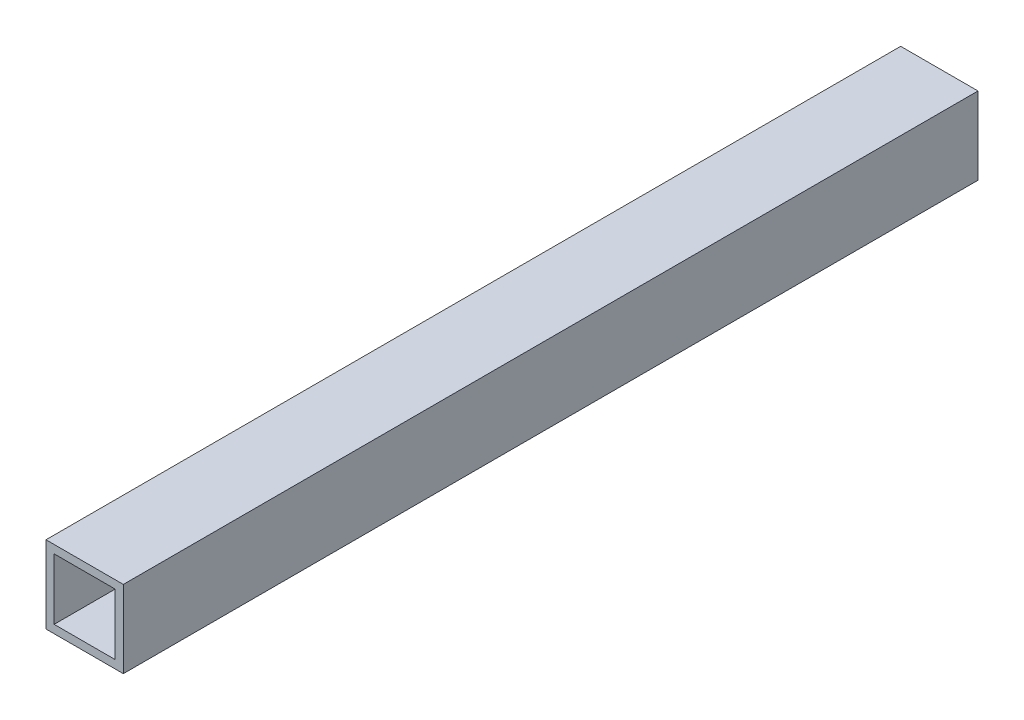
ISO-10303-21;
HEADER;
FILE_DESCRIPTION(('STEP AP214'),'2;1');
FILE_NAME('part.step','',(''),(''),'','','');
FILE_SCHEMA(('AUTOMOTIVE_DESIGN { 1 0 10303 214 1 1 1 1 }'));
ENDSEC;
DATA;
#1=APPLICATION_CONTEXT('core data for automotive mechanical design processes');
#2=APPLICATION_PROTOCOL_DEFINITION('international standard','automotive_design',2000,#1);
#3=PRODUCT_CONTEXT('',#1,'mechanical');
#4=PRODUCT('Part','Part','',(#3));
#5=PRODUCT_RELATED_PRODUCT_CATEGORY('part','',(#4));
#6=PRODUCT_DEFINITION_FORMATION('','',#4);
#7=PRODUCT_DEFINITION_CONTEXT('part definition',#1,'design');
#8=PRODUCT_DEFINITION('design','',#6,#7);
#9=PRODUCT_DEFINITION_SHAPE('','',#8);
#10=(LENGTH_UNIT() NAMED_UNIT(*) SI_UNIT(.MILLI.,.METRE.));
#11=(NAMED_UNIT(*) PLANE_ANGLE_UNIT() SI_UNIT($,.RADIAN.));
#12=(NAMED_UNIT(*) SI_UNIT($,.STERADIAN.) SOLID_ANGLE_UNIT());
#13=UNCERTAINTY_MEASURE_WITH_UNIT(LENGTH_MEASURE(1.E-05),#10,'distance_accuracy_value','');
#14=(GEOMETRIC_REPRESENTATION_CONTEXT(3) GLOBAL_UNCERTAINTY_ASSIGNED_CONTEXT((#13)) GLOBAL_UNIT_ASSIGNED_CONTEXT((#10,
#11,#12)) REPRESENTATION_CONTEXT('',''));
#15=CARTESIAN_POINT('',(0.,0.,0.));
#16=DIRECTION('',(0.,0.,1.));
#17=DIRECTION('',(1.,0.,0.));
#18=AXIS2_PLACEMENT_3D('',#15,#16,#17);
#19=CARTESIAN_POINT('',(0.,0.,210.));
#20=DIRECTION('',(0.,0.,-1.));
#21=DIRECTION('',(-1.,0.,0.));
#22=AXIS2_PLACEMENT_3D('',#19,#20,#21);
#23=PLANE('',#22);
#24=DIRECTION('',(0.,1.,0.));
#25=VECTOR('',#24,1.);
#26=CARTESIAN_POINT('',(9.5,-9.5,210.));
#27=LINE('',#26,#25);
#28=CARTESIAN_POINT('',(9.5,-9.5,210.));
#29=VERTEX_POINT('',#28);
#30=CARTESIAN_POINT('',(9.5,9.5,210.));
#31=VERTEX_POINT('',#30);
#32=EDGE_CURVE('E138',#29,#31,#27,.T.);
#33=ORIENTED_EDGE('',*,*,#32,.T.);
#34=DIRECTION('',(-1.,0.,0.));
#35=VECTOR('',#34,1.);
#36=CARTESIAN_POINT('',(-9.5,9.5,210.));
#37=LINE('',#36,#35);
#38=CARTESIAN_POINT('',(-9.5,9.5,210.));
#39=VERTEX_POINT('',#38);
#40=EDGE_CURVE('E141',#31,#39,#37,.T.);
#41=ORIENTED_EDGE('',*,*,#40,.T.);
#42=DIRECTION('',(0.,-1.,0.));
#43=VECTOR('',#42,1.);
#44=CARTESIAN_POINT('',(-9.5,-9.5,210.));
#45=LINE('',#44,#43);
#46=CARTESIAN_POINT('',(-9.5,-9.5,210.));
#47=VERTEX_POINT('',#46);
#48=EDGE_CURVE('E144',#39,#47,#45,.T.);
#49=ORIENTED_EDGE('',*,*,#48,.T.);
#50=DIRECTION('',(1.,0.,0.));
#51=VECTOR('',#50,1.);
#52=CARTESIAN_POINT('',(-9.5,-9.5,210.));
#53=LINE('',#52,#51);
#54=EDGE_CURVE('E146',#47,#29,#53,.T.);
#55=ORIENTED_EDGE('',*,*,#54,.T.);
#56=EDGE_LOOP('',(#33,#41,#49,#55));
#57=FACE_BOUND('',#56,.T.);
#58=DIRECTION('',(0.,-1.,0.));
#59=VECTOR('',#58,1.);
#60=CARTESIAN_POINT('',(-7.5,-7.5,210.));
#61=LINE('',#60,#59);
#62=CARTESIAN_POINT('',(-7.5,7.5,210.));
#63=VERTEX_POINT('',#62);
#64=CARTESIAN_POINT('',(-7.5,-7.5,210.));
#65=VERTEX_POINT('',#64);
#66=EDGE_CURVE('E102',#63,#65,#61,.T.);
#67=ORIENTED_EDGE('',*,*,#66,.F.);
#68=DIRECTION('',(-1.,0.,0.));
#69=VECTOR('',#68,1.);
#70=CARTESIAN_POINT('',(-7.5,7.5,210.));
#71=LINE('',#70,#69);
#72=CARTESIAN_POINT('',(7.5,7.5,210.));
#73=VERTEX_POINT('',#72);
#74=EDGE_CURVE('E124',#73,#63,#71,.T.);
#75=ORIENTED_EDGE('',*,*,#74,.F.);
#76=DIRECTION('',(0.,1.,0.));
#77=VECTOR('',#76,1.);
#78=CARTESIAN_POINT('',(7.5,-7.5,210.));
#79=LINE('',#78,#77);
#80=CARTESIAN_POINT('',(7.5,-7.5,210.));
#81=VERTEX_POINT('',#80);
#82=EDGE_CURVE('E122',#81,#73,#79,.T.);
#83=ORIENTED_EDGE('',*,*,#82,.F.);
#84=DIRECTION('',(1.,0.,0.));
#85=VECTOR('',#84,1.);
#86=CARTESIAN_POINT('',(-7.5,-7.5,210.));
#87=LINE('',#86,#85);
#88=EDGE_CURVE('E110',#65,#81,#87,.T.);
#89=ORIENTED_EDGE('',*,*,#88,.F.);
#90=EDGE_LOOP('',(#67,#75,#83,#89));
#91=FACE_BOUND('',#90,.T.);
#92=ADVANCED_FACE('F37',(#57,#91),#23,.F.);
#93=CARTESIAN_POINT('',(0.,0.,0.));
#94=DIRECTION('',(0.,0.,-1.));
#95=DIRECTION('',(-1.,0.,0.));
#96=AXIS2_PLACEMENT_3D('',#93,#94,#95);
#97=PLANE('',#96);
#98=DIRECTION('',(0.,1.,0.));
#99=VECTOR('',#98,1.);
#100=CARTESIAN_POINT('',(9.5,-9.5,0.));
#101=LINE('',#100,#99);
#102=CARTESIAN_POINT('',(9.5,-9.5,0.));
#103=VERTEX_POINT('',#102);
#104=CARTESIAN_POINT('',(9.5,9.5,0.));
#105=VERTEX_POINT('',#104);
#106=EDGE_CURVE('E118',#103,#105,#101,.T.);
#107=ORIENTED_EDGE('',*,*,#106,.F.);
#108=DIRECTION('',(1.,0.,0.));
#109=VECTOR('',#108,1.);
#110=CARTESIAN_POINT('',(-9.5,-9.5,0.));
#111=LINE('',#110,#109);
#112=CARTESIAN_POINT('',(-9.5,-9.5,0.));
#113=VERTEX_POINT('',#112);
#114=EDGE_CURVE('E142',#113,#103,#111,.T.);
#115=ORIENTED_EDGE('',*,*,#114,.F.);
#116=DIRECTION('',(0.,-1.,0.));
#117=VECTOR('',#116,1.);
#118=CARTESIAN_POINT('',(-9.5,-9.5,0.));
#119=LINE('',#118,#117);
#120=CARTESIAN_POINT('',(-9.5,9.5,0.));
#121=VERTEX_POINT('',#120);
#122=EDGE_CURVE('E153',#121,#113,#119,.T.);
#123=ORIENTED_EDGE('',*,*,#122,.F.);
#124=DIRECTION('',(-1.,0.,0.));
#125=VECTOR('',#124,1.);
#126=CARTESIAN_POINT('',(-9.5,9.5,0.));
#127=LINE('',#126,#125);
#128=EDGE_CURVE('E151',#105,#121,#127,.T.);
#129=ORIENTED_EDGE('',*,*,#128,.F.);
#130=EDGE_LOOP('',(#107,#115,#123,#129));
#131=FACE_BOUND('',#130,.T.);
#132=DIRECTION('',(-1.,0.,0.));
#133=VECTOR('',#132,1.);
#134=CARTESIAN_POINT('',(-7.5,7.5,0.));
#135=LINE('',#134,#133);
#136=CARTESIAN_POINT('',(7.5,7.5,0.));
#137=VERTEX_POINT('',#136);
#138=CARTESIAN_POINT('',(-7.5,7.5,0.));
#139=VERTEX_POINT('',#138);
#140=EDGE_CURVE('E111',#137,#139,#135,.T.);
#141=ORIENTED_EDGE('',*,*,#140,.T.);
#142=DIRECTION('',(0.,-1.,0.));
#143=VECTOR('',#142,1.);
#144=CARTESIAN_POINT('',(-7.5,-7.5,0.));
#145=LINE('',#144,#143);
#146=CARTESIAN_POINT('',(-7.5,-7.5,0.));
#147=VERTEX_POINT('',#146);
#148=EDGE_CURVE('E60',#139,#147,#145,.T.);
#149=ORIENTED_EDGE('',*,*,#148,.T.);
#150=DIRECTION('',(1.,0.,0.));
#151=VECTOR('',#150,1.);
#152=CARTESIAN_POINT('',(-7.5,-7.5,0.));
#153=LINE('',#152,#151);
#154=CARTESIAN_POINT('',(7.5,-7.5,0.));
#155=VERTEX_POINT('',#154);
#156=EDGE_CURVE('E117',#147,#155,#153,.T.);
#157=ORIENTED_EDGE('',*,*,#156,.T.);
#158=DIRECTION('',(0.,1.,0.));
#159=VECTOR('',#158,1.);
#160=CARTESIAN_POINT('',(7.5,-7.5,0.));
#161=LINE('',#160,#159);
#162=EDGE_CURVE('E130',#155,#137,#161,.T.);
#163=ORIENTED_EDGE('',*,*,#162,.T.);
#164=EDGE_LOOP('',(#141,#149,#157,#163));
#165=FACE_BOUND('',#164,.T.);
#166=ADVANCED_FACE('F171',(#131,#165),#97,.T.);
#167=CARTESIAN_POINT('',(9.5,-9.5,210.));
#168=DIRECTION('',(-1.,0.,0.));
#169=DIRECTION('',(0.,0.,1.));
#170=AXIS2_PLACEMENT_3D('',#167,#168,#169);
#171=PLANE('',#170);
#172=ORIENTED_EDGE('',*,*,#106,.T.);
#173=DIRECTION('',(0.,0.,-1.));
#174=VECTOR('',#173,1.);
#175=CARTESIAN_POINT('',(9.5,9.5,210.));
#176=LINE('',#175,#174);
#177=EDGE_CURVE('E11',#31,#105,#176,.T.);
#178=ORIENTED_EDGE('',*,*,#177,.F.);
#179=ORIENTED_EDGE('',*,*,#32,.F.);
#180=DIRECTION('',(0.,0.,-1.));
#181=VECTOR('',#180,1.);
#182=CARTESIAN_POINT('',(9.5,-9.5,210.));
#183=LINE('',#182,#181);
#184=EDGE_CURVE('E148',#29,#103,#183,.T.);
#185=ORIENTED_EDGE('',*,*,#184,.T.);
#186=EDGE_LOOP('',(#172,#178,#179,#185));
#187=FACE_BOUND('',#186,.T.);
#188=ADVANCED_FACE('F39',(#187),#171,.F.);
#189=CARTESIAN_POINT('',(-9.5,9.5,210.));
#190=DIRECTION('',(0.,-1.,0.));
#191=DIRECTION('',(0.,0.,-1.));
#192=AXIS2_PLACEMENT_3D('',#189,#190,#191);
#193=PLANE('',#192);
#194=ORIENTED_EDGE('',*,*,#128,.T.);
#195=DIRECTION('',(0.,0.,-1.));
#196=VECTOR('',#195,1.);
#197=CARTESIAN_POINT('',(-9.5,9.5,210.));
#198=LINE('',#197,#196);
#199=EDGE_CURVE('E45',#39,#121,#198,.T.);
#200=ORIENTED_EDGE('',*,*,#199,.F.);
#201=ORIENTED_EDGE('',*,*,#40,.F.);
#202=ORIENTED_EDGE('',*,*,#177,.T.);
#203=EDGE_LOOP('',(#194,#200,#201,#202));
#204=FACE_BOUND('',#203,.T.);
#205=ADVANCED_FACE('F181',(#204),#193,.F.);
#206=CARTESIAN_POINT('',(-9.5,-9.5,210.));
#207=DIRECTION('',(1.,0.,0.));
#208=DIRECTION('',(0.,0.,-1.));
#209=AXIS2_PLACEMENT_3D('',#206,#207,#208);
#210=PLANE('',#209);
#211=ORIENTED_EDGE('',*,*,#122,.T.);
#212=DIRECTION('',(0.,0.,-1.));
#213=VECTOR('',#212,1.);
#214=CARTESIAN_POINT('',(-9.5,-9.5,210.));
#215=LINE('',#214,#213);
#216=EDGE_CURVE('E158',#47,#113,#215,.T.);
#217=ORIENTED_EDGE('',*,*,#216,.F.);
#218=ORIENTED_EDGE('',*,*,#48,.F.);
#219=ORIENTED_EDGE('',*,*,#199,.T.);
#220=EDGE_LOOP('',(#211,#217,#218,#219));
#221=FACE_BOUND('',#220,.T.);
#222=ADVANCED_FACE('F165',(#221),#210,.F.);
#223=CARTESIAN_POINT('',(-9.5,-9.5,210.));
#224=DIRECTION('',(0.,1.,0.));
#225=DIRECTION('',(0.,0.,1.));
#226=AXIS2_PLACEMENT_3D('',#223,#224,#225);
#227=PLANE('',#226);
#228=ORIENTED_EDGE('',*,*,#114,.T.);
#229=ORIENTED_EDGE('',*,*,#184,.F.);
#230=ORIENTED_EDGE('',*,*,#54,.F.);
#231=ORIENTED_EDGE('',*,*,#216,.T.);
#232=EDGE_LOOP('',(#228,#229,#230,#231));
#233=FACE_BOUND('',#232,.T.);
#234=ADVANCED_FACE('F175',(#233),#227,.F.);
#235=CARTESIAN_POINT('',(-7.5,-7.5,210.));
#236=DIRECTION('',(1.,0.,0.));
#237=DIRECTION('',(0.,0.,-1.));
#238=AXIS2_PLACEMENT_3D('',#235,#236,#237);
#239=PLANE('',#238);
#240=ORIENTED_EDGE('',*,*,#148,.F.);
#241=DIRECTION('',(0.,0.,-1.));
#242=VECTOR('',#241,1.);
#243=CARTESIAN_POINT('',(-7.5,7.5,210.));
#244=LINE('',#243,#242);
#245=EDGE_CURVE('E106',#63,#139,#244,.T.);
#246=ORIENTED_EDGE('',*,*,#245,.F.);
#247=ORIENTED_EDGE('',*,*,#66,.T.);
#248=DIRECTION('',(0.,0.,-1.));
#249=VECTOR('',#248,1.);
#250=CARTESIAN_POINT('',(-7.5,-7.5,210.));
#251=LINE('',#250,#249);
#252=EDGE_CURVE('E105',#65,#147,#251,.T.);
#253=ORIENTED_EDGE('',*,*,#252,.T.);
#254=EDGE_LOOP('',(#240,#246,#247,#253));
#255=FACE_BOUND('',#254,.T.);
#256=ADVANCED_FACE('F104',(#255),#239,.T.);
#257=CARTESIAN_POINT('',(-7.5,-7.5,210.));
#258=DIRECTION('',(0.,1.,0.));
#259=DIRECTION('',(0.,0.,1.));
#260=AXIS2_PLACEMENT_3D('',#257,#258,#259);
#261=PLANE('',#260);
#262=ORIENTED_EDGE('',*,*,#156,.F.);
#263=ORIENTED_EDGE('',*,*,#252,.F.);
#264=ORIENTED_EDGE('',*,*,#88,.T.);
#265=DIRECTION('',(0.,0.,-1.));
#266=VECTOR('',#265,1.);
#267=CARTESIAN_POINT('',(7.5,-7.5,210.));
#268=LINE('',#267,#266);
#269=EDGE_CURVE('E119',#81,#155,#268,.T.);
#270=ORIENTED_EDGE('',*,*,#269,.T.);
#271=EDGE_LOOP('',(#262,#263,#264,#270));
#272=FACE_BOUND('',#271,.T.);
#273=ADVANCED_FACE('F114',(#272),#261,.T.);
#274=CARTESIAN_POINT('',(7.5,-7.5,210.));
#275=DIRECTION('',(-1.,0.,0.));
#276=DIRECTION('',(0.,0.,1.));
#277=AXIS2_PLACEMENT_3D('',#274,#275,#276);
#278=PLANE('',#277);
#279=ORIENTED_EDGE('',*,*,#162,.F.);
#280=ORIENTED_EDGE('',*,*,#269,.F.);
#281=ORIENTED_EDGE('',*,*,#82,.T.);
#282=DIRECTION('',(0.,0.,-1.));
#283=VECTOR('',#282,1.);
#284=CARTESIAN_POINT('',(7.5,7.5,210.));
#285=LINE('',#284,#283);
#286=EDGE_CURVE('E52',#73,#137,#285,.T.);
#287=ORIENTED_EDGE('',*,*,#286,.T.);
#288=EDGE_LOOP('',(#279,#280,#281,#287));
#289=FACE_BOUND('',#288,.T.);
#290=ADVANCED_FACE('F204',(#289),#278,.T.);
#291=CARTESIAN_POINT('',(-7.5,7.5,210.));
#292=DIRECTION('',(0.,-1.,0.));
#293=DIRECTION('',(0.,0.,-1.));
#294=AXIS2_PLACEMENT_3D('',#291,#292,#293);
#295=PLANE('',#294);
#296=ORIENTED_EDGE('',*,*,#140,.F.);
#297=ORIENTED_EDGE('',*,*,#286,.F.);
#298=ORIENTED_EDGE('',*,*,#74,.T.);
#299=ORIENTED_EDGE('',*,*,#245,.T.);
#300=EDGE_LOOP('',(#296,#297,#298,#299));
#301=FACE_BOUND('',#300,.T.);
#302=ADVANCED_FACE('F208',(#301),#295,.T.);
#303=CLOSED_SHELL('',(#92,#166,#188,#205,#222,#234,#256,#273,#290,#302));
#304=MANIFOLD_SOLID_BREP('B2',#303);
#305=ADVANCED_BREP_SHAPE_REPRESENTATION('',(#18,#304),#14);
#306=SHAPE_DEFINITION_REPRESENTATION(#9,#305);
ENDSEC;
END-ISO-10303-21;
